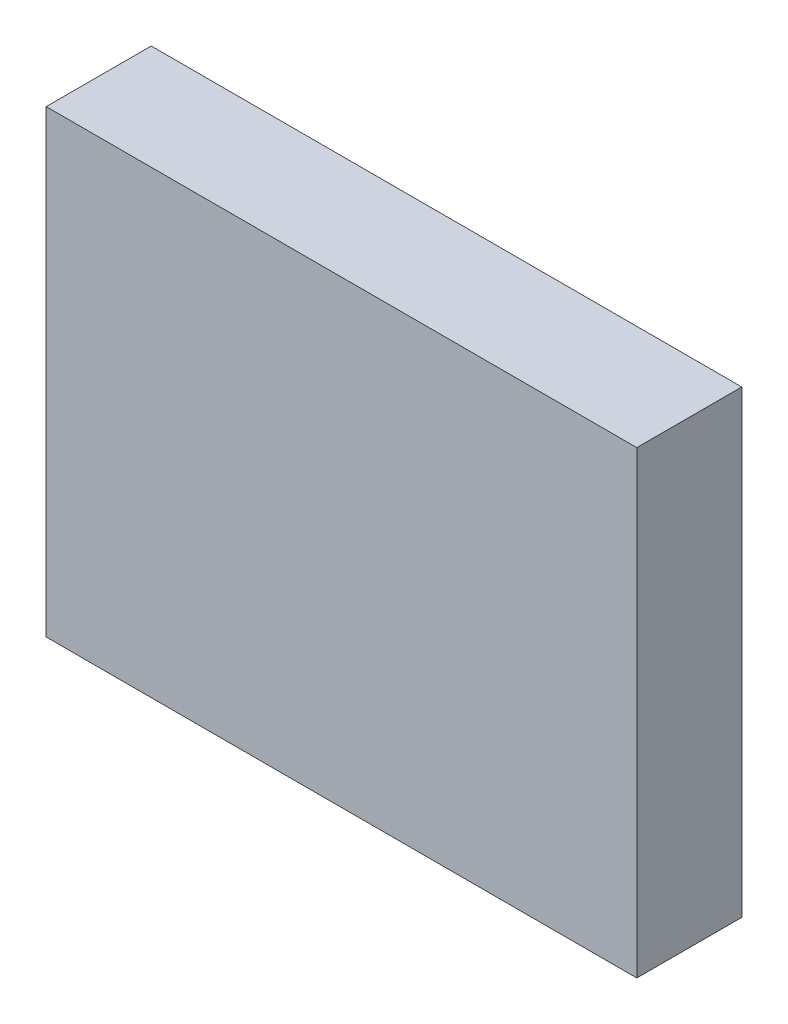
ISO-10303-21;
HEADER;
FILE_DESCRIPTION(('STEP AP214'),'2;1');
FILE_NAME('part.step','',(''),(''),'','','');
FILE_SCHEMA(('AUTOMOTIVE_DESIGN { 1 0 10303 214 1 1 1 1 }'));
ENDSEC;
DATA;
#1=APPLICATION_CONTEXT('core data for automotive mechanical design processes');
#2=APPLICATION_PROTOCOL_DEFINITION('international standard','automotive_design',2000,#1);
#3=PRODUCT_CONTEXT('',#1,'mechanical');
#4=PRODUCT('Part','Part','',(#3));
#5=PRODUCT_RELATED_PRODUCT_CATEGORY('part','',(#4));
#6=PRODUCT_DEFINITION_FORMATION('','',#4);
#7=PRODUCT_DEFINITION_CONTEXT('part definition',#1,'design');
#8=PRODUCT_DEFINITION('design','',#6,#7);
#9=PRODUCT_DEFINITION_SHAPE('','',#8);
#10=(LENGTH_UNIT() NAMED_UNIT(*) SI_UNIT(.MILLI.,.METRE.));
#11=(NAMED_UNIT(*) PLANE_ANGLE_UNIT() SI_UNIT($,.RADIAN.));
#12=(NAMED_UNIT(*) SI_UNIT($,.STERADIAN.) SOLID_ANGLE_UNIT());
#13=UNCERTAINTY_MEASURE_WITH_UNIT(LENGTH_MEASURE(1.E-05),#10,'distance_accuracy_value','');
#14=(GEOMETRIC_REPRESENTATION_CONTEXT(3) GLOBAL_UNCERTAINTY_ASSIGNED_CONTEXT((#13)) GLOBAL_UNIT_ASSIGNED_CONTEXT((#10,
#11,#12)) REPRESENTATION_CONTEXT('',''));
#15=CARTESIAN_POINT('',(0.,0.,0.));
#16=DIRECTION('',(0.,0.,1.));
#17=DIRECTION('',(1.,0.,0.));
#18=AXIS2_PLACEMENT_3D('',#15,#16,#17);
#19=CARTESIAN_POINT('',(-12.9063570612866,28.8380281690141,16.));
#20=DIRECTION('',(1.,0.,0.));
#21=DIRECTION('',(0.,1.,0.));
#22=AXIS2_PLACEMENT_3D('',#19,#20,#21);
#23=PLANE('',#22);
#24=DIRECTION('',(0.,-1.,0.));
#25=VECTOR('',#24,1.);
#26=CARTESIAN_POINT('',(-12.9063570612866,28.8380281690141,0.));
#27=LINE('',#26,#25);
#28=CARTESIAN_POINT('',(-12.9063570612866,28.8380281690141,0.));
#29=VERTEX_POINT('',#28);
#30=CARTESIAN_POINT('',(-12.9063570612866,-41.1619718309859,0.));
#31=VERTEX_POINT('',#30);
#32=EDGE_CURVE('E96',#29,#31,#27,.T.);
#33=ORIENTED_EDGE('',*,*,#32,.T.);
#34=DIRECTION('',(0.,0.,-1.));
#35=VECTOR('',#34,1.);
#36=CARTESIAN_POINT('',(-12.9063570612866,-41.1619718309859,16.));
#37=LINE('',#36,#35);
#38=CARTESIAN_POINT('',(-12.9063570612866,-41.1619718309859,16.));
#39=VERTEX_POINT('',#38);
#40=EDGE_CURVE('E11',#39,#31,#37,.T.);
#41=ORIENTED_EDGE('',*,*,#40,.F.);
#42=DIRECTION('',(0.,-1.,0.));
#43=VECTOR('',#42,1.);
#44=CARTESIAN_POINT('',(-12.9063570612866,28.8380281690141,16.));
#45=LINE('',#44,#43);
#46=CARTESIAN_POINT('',(-12.9063570612866,28.8380281690141,16.));
#47=VERTEX_POINT('',#46);
#48=EDGE_CURVE('E84',#47,#39,#45,.T.);
#49=ORIENTED_EDGE('',*,*,#48,.F.);
#50=DIRECTION('',(0.,0.,-1.));
#51=VECTOR('',#50,1.);
#52=CARTESIAN_POINT('',(-12.9063570612866,28.8380281690141,16.));
#53=LINE('',#52,#51);
#54=EDGE_CURVE('E92',#47,#29,#53,.T.);
#55=ORIENTED_EDGE('',*,*,#54,.T.);
#56=EDGE_LOOP('',(#33,#41,#49,#55));
#57=FACE_BOUND('',#56,.T.);
#58=ADVANCED_FACE('F33',(#57),#23,.F.);
#59=CARTESIAN_POINT('',(-12.9063570612866,-41.1619718309859,16.));
#60=DIRECTION('',(0.,1.,0.));
#61=DIRECTION('',(0.,0.,1.));
#62=AXIS2_PLACEMENT_3D('',#59,#60,#61);
#63=PLANE('',#62);
#64=DIRECTION('',(1.,0.,0.));
#65=VECTOR('',#64,1.);
#66=CARTESIAN_POINT('',(-12.9063570612866,-41.1619718309859,0.));
#67=LINE('',#66,#65);
#68=CARTESIAN_POINT('',(77.0936429387134,-41.1619718309859,0.));
#69=VERTEX_POINT('',#68);
#70=EDGE_CURVE('E88',#31,#69,#67,.T.);
#71=ORIENTED_EDGE('',*,*,#70,.T.);
#72=DIRECTION('',(0.,0.,-1.));
#73=VECTOR('',#72,1.);
#74=CARTESIAN_POINT('',(77.0936429387134,-41.1619718309859,16.));
#75=LINE('',#74,#73);
#76=CARTESIAN_POINT('',(77.0936429387134,-41.1619718309859,16.));
#77=VERTEX_POINT('',#76);
#78=EDGE_CURVE('E41',#77,#69,#75,.T.);
#79=ORIENTED_EDGE('',*,*,#78,.F.);
#80=DIRECTION('',(1.,0.,0.));
#81=VECTOR('',#80,1.);
#82=CARTESIAN_POINT('',(-12.9063570612866,-41.1619718309859,16.));
#83=LINE('',#82,#81);
#84=EDGE_CURVE('E79',#39,#77,#83,.T.);
#85=ORIENTED_EDGE('',*,*,#84,.F.);
#86=ORIENTED_EDGE('',*,*,#40,.T.);
#87=EDGE_LOOP('',(#71,#79,#85,#86));
#88=FACE_BOUND('',#87,.T.);
#89=ADVANCED_FACE('F87',(#88),#63,.F.);
#90=CARTESIAN_POINT('',(77.0936429387134,28.8380281690141,16.));
#91=DIRECTION('',(-1.,0.,0.));
#92=DIRECTION('',(0.,0.,1.));
#93=AXIS2_PLACEMENT_3D('',#90,#91,#92);
#94=PLANE('',#93);
#95=DIRECTION('',(0.,1.,0.));
#96=VECTOR('',#95,1.);
#97=CARTESIAN_POINT('',(77.0936429387134,28.8380281690141,0.));
#98=LINE('',#97,#96);
#99=CARTESIAN_POINT('',(77.0936429387134,28.8380281690141,0.));
#100=VERTEX_POINT('',#99);
#101=EDGE_CURVE('E66',#69,#100,#98,.T.);
#102=ORIENTED_EDGE('',*,*,#101,.T.);
#103=DIRECTION('',(0.,0.,-1.));
#104=VECTOR('',#103,1.);
#105=CARTESIAN_POINT('',(77.0936429387134,28.8380281690141,16.));
#106=LINE('',#105,#104);
#107=CARTESIAN_POINT('',(77.0936429387134,28.8380281690141,16.));
#108=VERTEX_POINT('',#107);
#109=EDGE_CURVE('E89',#108,#100,#106,.T.);
#110=ORIENTED_EDGE('',*,*,#109,.F.);
#111=DIRECTION('',(0.,1.,0.));
#112=VECTOR('',#111,1.);
#113=CARTESIAN_POINT('',(77.0936429387134,28.8380281690141,16.));
#114=LINE('',#113,#112);
#115=EDGE_CURVE('E82',#77,#108,#114,.T.);
#116=ORIENTED_EDGE('',*,*,#115,.F.);
#117=ORIENTED_EDGE('',*,*,#78,.T.);
#118=EDGE_LOOP('',(#102,#110,#116,#117));
#119=FACE_BOUND('',#118,.T.);
#120=ADVANCED_FACE('F90',(#119),#94,.F.);
#121=CARTESIAN_POINT('',(-12.9063570612866,28.8380281690141,16.));
#122=DIRECTION('',(0.,-1.,0.));
#123=DIRECTION('',(0.,0.,-1.));
#124=AXIS2_PLACEMENT_3D('',#121,#122,#123);
#125=PLANE('',#124);
#126=DIRECTION('',(-1.,0.,0.));
#127=VECTOR('',#126,1.);
#128=CARTESIAN_POINT('',(-12.9063570612866,28.8380281690141,0.));
#129=LINE('',#128,#127);
#130=EDGE_CURVE('E72',#100,#29,#129,.T.);
#131=ORIENTED_EDGE('',*,*,#130,.T.);
#132=ORIENTED_EDGE('',*,*,#54,.F.);
#133=DIRECTION('',(-1.,0.,0.));
#134=VECTOR('',#133,1.);
#135=CARTESIAN_POINT('',(-12.9063570612866,28.8380281690141,16.));
#136=LINE('',#135,#134);
#137=EDGE_CURVE('E49',#108,#47,#136,.T.);
#138=ORIENTED_EDGE('',*,*,#137,.F.);
#139=ORIENTED_EDGE('',*,*,#109,.T.);
#140=EDGE_LOOP('',(#131,#132,#138,#139));
#141=FACE_BOUND('',#140,.T.);
#142=ADVANCED_FACE('F103',(#141),#125,.F.);
#143=CARTESIAN_POINT('',(0.,0.,16.));
#144=DIRECTION('',(0.,0.,1.));
#145=DIRECTION('',(1.,0.,0.));
#146=AXIS2_PLACEMENT_3D('',#143,#144,#145);
#147=PLANE('',#146);
#148=ORIENTED_EDGE('',*,*,#48,.T.);
#149=ORIENTED_EDGE('',*,*,#84,.T.);
#150=ORIENTED_EDGE('',*,*,#115,.T.);
#151=ORIENTED_EDGE('',*,*,#137,.T.);
#152=EDGE_LOOP('',(#148,#149,#150,#151));
#153=FACE_BOUND('',#152,.T.);
#154=ADVANCED_FACE('F80',(#153),#147,.T.);
#155=CARTESIAN_POINT('',(0.,0.,0.));
#156=DIRECTION('',(0.,0.,1.));
#157=DIRECTION('',(1.,0.,0.));
#158=AXIS2_PLACEMENT_3D('',#155,#156,#157);
#159=PLANE('',#158);
#160=ORIENTED_EDGE('',*,*,#32,.F.);
#161=ORIENTED_EDGE('',*,*,#130,.F.);
#162=ORIENTED_EDGE('',*,*,#101,.F.);
#163=ORIENTED_EDGE('',*,*,#70,.F.);
#164=EDGE_LOOP('',(#160,#161,#162,#163));
#165=FACE_BOUND('',#164,.T.);
#166=ADVANCED_FACE('F106',(#165),#159,.F.);
#167=CLOSED_SHELL('',(#58,#89,#120,#142,#154,#166));
#168=MANIFOLD_SOLID_BREP('B2',#167);
#169=ADVANCED_BREP_SHAPE_REPRESENTATION('',(#18,#168),#14);
#170=SHAPE_DEFINITION_REPRESENTATION(#9,#169);
ENDSEC;
END-ISO-10303-21;
